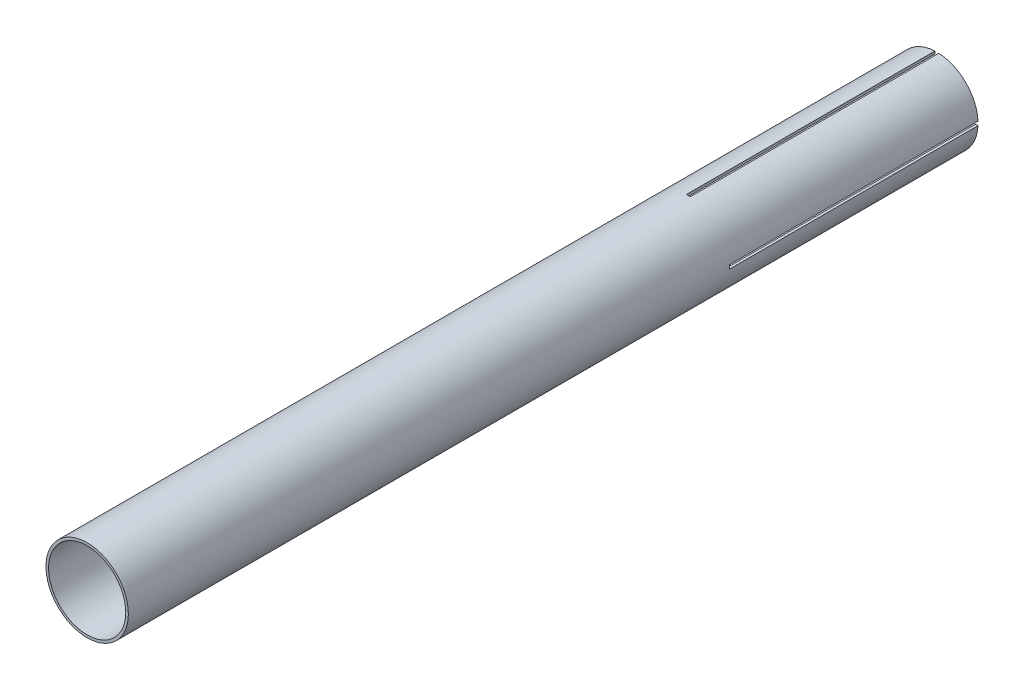
ISO-10303-21;
HEADER;
FILE_DESCRIPTION(('STEP AP214'),'2;1');
FILE_NAME('part.step','',(''),(''),'','','');
FILE_SCHEMA(('AUTOMOTIVE_DESIGN { 1 0 10303 214 1 1 1 1 }'));
ENDSEC;
DATA;
#1=APPLICATION_CONTEXT('core data for automotive mechanical design processes');
#2=APPLICATION_PROTOCOL_DEFINITION('international standard','automotive_design',2000,#1);
#3=PRODUCT_CONTEXT('',#1,'mechanical');
#4=PRODUCT('Part','Part','',(#3));
#5=PRODUCT_RELATED_PRODUCT_CATEGORY('part','',(#4));
#6=PRODUCT_DEFINITION_FORMATION('','',#4);
#7=PRODUCT_DEFINITION_CONTEXT('part definition',#1,'design');
#8=PRODUCT_DEFINITION('design','',#6,#7);
#9=PRODUCT_DEFINITION_SHAPE('','',#8);
#10=(LENGTH_UNIT() NAMED_UNIT(*) SI_UNIT(.MILLI.,.METRE.));
#11=(NAMED_UNIT(*) PLANE_ANGLE_UNIT() SI_UNIT($,.RADIAN.));
#12=(NAMED_UNIT(*) SI_UNIT($,.STERADIAN.) SOLID_ANGLE_UNIT());
#13=UNCERTAINTY_MEASURE_WITH_UNIT(LENGTH_MEASURE(1.E-05),#10,'distance_accuracy_value','');
#14=(GEOMETRIC_REPRESENTATION_CONTEXT(3) GLOBAL_UNCERTAINTY_ASSIGNED_CONTEXT((#13)) GLOBAL_UNIT_ASSIGNED_CONTEXT((#10,
#11,#12)) REPRESENTATION_CONTEXT('',''));
#15=CARTESIAN_POINT('',(0.,0.,0.));
#16=DIRECTION('',(0.,0.,1.));
#17=DIRECTION('',(1.,0.,0.));
#18=AXIS2_PLACEMENT_3D('',#15,#16,#17);
#19=CARTESIAN_POINT('',(0.,0.,0.));
#20=DIRECTION('',(0.,0.,1.));
#21=DIRECTION('',(1.,0.,0.));
#22=AXIS2_PLACEMENT_3D('',#19,#20,#21);
#23=PLANE('',#22);
#24=CARTESIAN_POINT('',(0.,0.,0.));
#25=DIRECTION('',(0.,0.,1.));
#26=DIRECTION('',(1.,0.,0.));
#27=AXIS2_PLACEMENT_3D('',#24,#25,#26);
#28=CIRCLE('',#27,30.);
#29=CARTESIAN_POINT('',(-1.50000000000008,29.9624765331573,0.));
#30=VERTEX_POINT('',#29);
#31=CARTESIAN_POINT('',(-29.9624765331573,1.5000000000001,0.));
#32=VERTEX_POINT('',#31);
#33=EDGE_CURVE('E172',#30,#32,#28,.T.);
#34=ORIENTED_EDGE('',*,*,#33,.T.);
#35=DIRECTION('',(1.,0.,0.));
#36=VECTOR('',#35,1.);
#37=CARTESIAN_POINT('',(-32.0010000000001,1.50000000000011,0.));
#38=LINE('',#37,#36);
#39=CARTESIAN_POINT('',(-31.9648244168492,1.50000000000011,0.));
#40=VERTEX_POINT('',#39);
#41=EDGE_CURVE('E152',#40,#32,#38,.T.);
#42=ORIENTED_EDGE('',*,*,#41,.F.);
#43=CARTESIAN_POINT('',(0.,0.,0.));
#44=DIRECTION('',(0.,0.,1.));
#45=DIRECTION('',(1.,0.,0.));
#46=AXIS2_PLACEMENT_3D('',#43,#44,#45);
#47=CIRCLE('',#46,32.);
#48=CARTESIAN_POINT('',(-1.5,31.9648244168492,0.));
#49=VERTEX_POINT('',#48);
#50=EDGE_CURVE('E335',#49,#40,#47,.T.);
#51=ORIENTED_EDGE('',*,*,#50,.F.);
#52=DIRECTION('',(0.,-1.,0.));
#53=VECTOR('',#52,1.);
#54=CARTESIAN_POINT('',(-1.5,32.001,0.));
#55=LINE('',#54,#53);
#56=EDGE_CURVE('E179',#49,#30,#55,.T.);
#57=ORIENTED_EDGE('',*,*,#56,.T.);
#58=EDGE_LOOP('',(#34,#42,#51,#57));
#59=FACE_BOUND('',#58,.T.);
#60=ADVANCED_FACE('F39',(#59),#23,.F.);
#61=CARTESIAN_POINT('',(29.9624765331573,1.49999999999977,0.));
#62=VERTEX_POINT('',#61);
#63=CARTESIAN_POINT('',(1.5,29.9624765331573,0.));
#64=VERTEX_POINT('',#63);
#65=EDGE_CURVE('E181',#62,#64,#28,.T.);
#66=ORIENTED_EDGE('',*,*,#65,.T.);
#67=DIRECTION('',(0.,-1.,0.));
#68=VECTOR('',#67,1.);
#69=CARTESIAN_POINT('',(1.5,32.001,0.));
#70=LINE('',#69,#68);
#71=CARTESIAN_POINT('',(1.5,31.9648244168492,0.));
#72=VERTEX_POINT('',#71);
#73=EDGE_CURVE('E281',#72,#64,#70,.T.);
#74=ORIENTED_EDGE('',*,*,#73,.F.);
#75=CARTESIAN_POINT('',(31.9648244168492,1.49999999999967,0.));
#76=VERTEX_POINT('',#75);
#77=EDGE_CURVE('E337',#76,#72,#47,.T.);
#78=ORIENTED_EDGE('',*,*,#77,.F.);
#79=DIRECTION('',(-1.,0.,0.));
#80=VECTOR('',#79,1.);
#81=CARTESIAN_POINT('',(32.0010000000004,1.49999999999966,0.));
#82=LINE('',#81,#80);
#83=EDGE_CURVE('E254',#76,#62,#82,.T.);
#84=ORIENTED_EDGE('',*,*,#83,.T.);
#85=EDGE_LOOP('',(#66,#74,#78,#84));
#86=FACE_BOUND('',#85,.T.);
#87=ADVANCED_FACE('F353',(#86),#23,.F.);
#88=CARTESIAN_POINT('',(1.50000000000008,-29.9624765331573,0.));
#89=VERTEX_POINT('',#88);
#90=CARTESIAN_POINT('',(29.9624765331573,-1.50000000000031,0.));
#91=VERTEX_POINT('',#90);
#92=EDGE_CURVE('E187',#89,#91,#28,.T.);
#93=ORIENTED_EDGE('',*,*,#92,.T.);
#94=DIRECTION('',(-1.,0.,0.));
#95=VECTOR('',#94,1.);
#96=CARTESIAN_POINT('',(32.0010000000003,-1.50000000000034,0.));
#97=LINE('',#96,#95);
#98=CARTESIAN_POINT('',(31.9648244168492,-1.50000000000033,0.));
#99=VERTEX_POINT('',#98);
#100=EDGE_CURVE('E245',#99,#91,#97,.T.);
#101=ORIENTED_EDGE('',*,*,#100,.F.);
#102=CARTESIAN_POINT('',(1.5,-31.9648244168492,0.));
#103=VERTEX_POINT('',#102);
#104=EDGE_CURVE('E43',#103,#99,#47,.T.);
#105=ORIENTED_EDGE('',*,*,#104,.F.);
#106=DIRECTION('',(0.,1.,0.));
#107=VECTOR('',#106,1.);
#108=CARTESIAN_POINT('',(1.5,-32.001,0.));
#109=LINE('',#108,#107);
#110=EDGE_CURVE('E213',#103,#89,#109,.T.);
#111=ORIENTED_EDGE('',*,*,#110,.T.);
#112=EDGE_LOOP('',(#93,#101,#105,#111));
#113=FACE_BOUND('',#112,.T.);
#114=ADVANCED_FACE('F374',(#113),#23,.F.);
#115=CARTESIAN_POINT('',(0.,0.,660.));
#116=DIRECTION('',(0.,0.,1.));
#117=DIRECTION('',(1.,0.,0.));
#118=AXIS2_PLACEMENT_3D('',#115,#116,#117);
#119=PLANE('',#118);
#120=CARTESIAN_POINT('',(0.,0.,660.));
#121=DIRECTION('',(0.,0.,1.));
#122=DIRECTION('',(1.,0.,0.));
#123=AXIS2_PLACEMENT_3D('',#120,#121,#122);
#124=CIRCLE('',#123,32.);
#125=CARTESIAN_POINT('',(32.,0.,660.));
#126=VERTEX_POINT('',#125);
#127=EDGE_CURVE('E11',#126,#126,#124,.T.);
#128=ORIENTED_EDGE('',*,*,#127,.T.);
#129=EDGE_LOOP('',(#128));
#130=FACE_BOUND('',#129,.T.);
#131=CARTESIAN_POINT('',(0.,0.,660.));
#132=DIRECTION('',(0.,0.,1.));
#133=DIRECTION('',(1.,0.,0.));
#134=AXIS2_PLACEMENT_3D('',#131,#132,#133);
#135=CIRCLE('',#134,30.);
#136=CARTESIAN_POINT('',(30.,0.,660.));
#137=VERTEX_POINT('',#136);
#138=EDGE_CURVE('E192',#137,#137,#135,.T.);
#139=ORIENTED_EDGE('',*,*,#138,.F.);
#140=EDGE_LOOP('',(#139));
#141=FACE_BOUND('',#140,.T.);
#142=ADVANCED_FACE('F377',(#130,#141),#119,.T.);
#143=CARTESIAN_POINT('',(-31.9648244168492,-1.49999999999989,0.));
#144=VERTEX_POINT('',#143);
#145=CARTESIAN_POINT('',(-1.5,-31.9648244168492,0.));
#146=VERTEX_POINT('',#145);
#147=EDGE_CURVE('E196',#144,#146,#47,.T.);
#148=ORIENTED_EDGE('',*,*,#147,.F.);
#149=DIRECTION('',(1.,0.,0.));
#150=VECTOR('',#149,1.);
#151=CARTESIAN_POINT('',(-32.0010000000001,-1.49999999999989,0.));
#152=LINE('',#151,#150);
#153=CARTESIAN_POINT('',(-29.9624765331573,-1.49999999999998,0.));
#154=VERTEX_POINT('',#153);
#155=EDGE_CURVE('E165',#144,#154,#152,.T.);
#156=ORIENTED_EDGE('',*,*,#155,.T.);
#157=CARTESIAN_POINT('',(-1.5,-29.9624765331573,0.));
#158=VERTEX_POINT('',#157);
#159=EDGE_CURVE('E182',#154,#158,#28,.T.);
#160=ORIENTED_EDGE('',*,*,#159,.T.);
#161=DIRECTION('',(0.,1.,0.));
#162=VECTOR('',#161,1.);
#163=CARTESIAN_POINT('',(-1.5,-32.001,0.));
#164=LINE('',#163,#162);
#165=EDGE_CURVE('E204',#146,#158,#164,.T.);
#166=ORIENTED_EDGE('',*,*,#165,.F.);
#167=EDGE_LOOP('',(#148,#156,#160,#166));
#168=FACE_BOUND('',#167,.T.);
#169=ADVANCED_FACE('F330',(#168),#23,.F.);
#170=CARTESIAN_POINT('',(0.,0.,660.));
#171=DIRECTION('',(0.,0.,-1.));
#172=DIRECTION('',(-1.,0.,0.));
#173=AXIS2_PLACEMENT_3D('',#170,#171,#172);
#174=CYLINDRICAL_SURFACE('',#173,32.);
#175=ORIENTED_EDGE('',*,*,#50,.T.);
#176=DIRECTION('',(0.,0.,-1.));
#177=VECTOR('',#176,1.);
#178=CARTESIAN_POINT('',(-31.9648244168492,1.50000000000003,660.));
#179=LINE('',#178,#177);
#180=CARTESIAN_POINT('',(-31.9648244168492,1.50000000000009,193.));
#181=VERTEX_POINT('',#180);
#182=EDGE_CURVE('E158',#181,#40,#179,.T.);
#183=ORIENTED_EDGE('',*,*,#182,.F.);
#184=CARTESIAN_POINT('',(0.,0.,193.));
#185=DIRECTION('',(0.,0.,1.));
#186=DIRECTION('',(1.,0.,0.));
#187=AXIS2_PLACEMENT_3D('',#184,#185,#186);
#188=CIRCLE('',#187,32.);
#189=CARTESIAN_POINT('',(-31.9648244168492,-1.49999999999991,193.));
#190=VERTEX_POINT('',#189);
#191=EDGE_CURVE('E235',#190,#181,#188,.F.);
#192=ORIENTED_EDGE('',*,*,#191,.F.);
#193=DIRECTION('',(0.,0.,-1.));
#194=VECTOR('',#193,1.);
#195=CARTESIAN_POINT('',(-31.9648244168492,-1.49999999999997,660.));
#196=LINE('',#195,#194);
#197=EDGE_CURVE('E175',#144,#190,#196,.F.);
#198=ORIENTED_EDGE('',*,*,#197,.F.);
#199=ORIENTED_EDGE('',*,*,#147,.T.);
#200=DIRECTION('',(0.,0.,-1.));
#201=VECTOR('',#200,1.);
#202=CARTESIAN_POINT('',(-1.49999999999992,-31.9648244168492,660.));
#203=LINE('',#202,#201);
#204=CARTESIAN_POINT('',(-1.49999999999998,-31.9648244168492,193.));
#205=VERTEX_POINT('',#204);
#206=EDGE_CURVE('E209',#205,#146,#203,.T.);
#207=ORIENTED_EDGE('',*,*,#206,.F.);
#208=CARTESIAN_POINT('',(0.,0.,193.));
#209=DIRECTION('',(0.,0.,1.));
#210=DIRECTION('',(1.,0.,0.));
#211=AXIS2_PLACEMENT_3D('',#208,#209,#210);
#212=CIRCLE('',#211,32.);
#213=CARTESIAN_POINT('',(1.50000000000002,-31.9648244168492,193.));
#214=VERTEX_POINT('',#213);
#215=EDGE_CURVE('E188',#214,#205,#212,.F.);
#216=ORIENTED_EDGE('',*,*,#215,.F.);
#217=DIRECTION('',(0.,0.,-1.));
#218=VECTOR('',#217,1.);
#219=CARTESIAN_POINT('',(1.50000000000008,-31.9648244168492,660.));
#220=LINE('',#219,#218);
#221=EDGE_CURVE('E223',#103,#214,#220,.F.);
#222=ORIENTED_EDGE('',*,*,#221,.F.);
#223=ORIENTED_EDGE('',*,*,#104,.T.);
#224=DIRECTION('',(0.,0.,-1.));
#225=VECTOR('',#224,1.);
#226=CARTESIAN_POINT('',(31.9648244168492,-1.50000000000025,660.));
#227=LINE('',#226,#225);
#228=CARTESIAN_POINT('',(31.9648244168492,-1.50000000000031,193.));
#229=VERTEX_POINT('',#228);
#230=EDGE_CURVE('E250',#229,#99,#227,.T.);
#231=ORIENTED_EDGE('',*,*,#230,.F.);
#232=CARTESIAN_POINT('',(0.,0.,193.));
#233=DIRECTION('',(0.,0.,1.));
#234=DIRECTION('',(1.,0.,0.));
#235=AXIS2_PLACEMENT_3D('',#232,#233,#234);
#236=CIRCLE('',#235,32.);
#237=CARTESIAN_POINT('',(31.9648244168492,1.49999999999969,193.));
#238=VERTEX_POINT('',#237);
#239=EDGE_CURVE('E236',#238,#229,#236,.F.);
#240=ORIENTED_EDGE('',*,*,#239,.F.);
#241=DIRECTION('',(0.,0.,-1.));
#242=VECTOR('',#241,1.);
#243=CARTESIAN_POINT('',(31.9648244168492,1.49999999999975,660.));
#244=LINE('',#243,#242);
#245=EDGE_CURVE('E262',#76,#238,#244,.F.);
#246=ORIENTED_EDGE('',*,*,#245,.F.);
#247=ORIENTED_EDGE('',*,*,#77,.T.);
#248=DIRECTION('',(0.,0.,-1.));
#249=VECTOR('',#248,1.);
#250=CARTESIAN_POINT('',(1.49999999999992,31.9648244168492,660.));
#251=LINE('',#250,#249);
#252=CARTESIAN_POINT('',(1.49999999999998,31.9648244168492,193.));
#253=VERTEX_POINT('',#252);
#254=EDGE_CURVE('E285',#253,#72,#251,.T.);
#255=ORIENTED_EDGE('',*,*,#254,.F.);
#256=CARTESIAN_POINT('',(0.,0.,193.));
#257=DIRECTION('',(0.,0.,1.));
#258=DIRECTION('',(1.,0.,0.));
#259=AXIS2_PLACEMENT_3D('',#256,#257,#258);
#260=CIRCLE('',#259,32.);
#261=CARTESIAN_POINT('',(-1.50000000000002,31.9648244168492,193.));
#262=VERTEX_POINT('',#261);
#263=EDGE_CURVE('E274',#262,#253,#260,.F.);
#264=ORIENTED_EDGE('',*,*,#263,.F.);
#265=DIRECTION('',(0.,0.,-1.));
#266=VECTOR('',#265,1.);
#267=CARTESIAN_POINT('',(-1.50000000000008,31.9648244168492,660.));
#268=LINE('',#267,#266);
#269=EDGE_CURVE('E295',#49,#262,#268,.F.);
#270=ORIENTED_EDGE('',*,*,#269,.F.);
#271=EDGE_LOOP('',(#175,#183,#192,#198,#199,#207,#216,#222,#223,#231,#240,#246,#247,#255,#264,#270));
#272=FACE_BOUND('',#271,.T.);
#273=ORIENTED_EDGE('',*,*,#127,.F.);
#274=EDGE_LOOP('',(#273));
#275=FACE_BOUND('',#274,.T.);
#276=ADVANCED_FACE('F41',(#272,#275),#174,.T.);
#277=CARTESIAN_POINT('',(0.,0.,660.));
#278=DIRECTION('',(0.,0.,-1.));
#279=DIRECTION('',(-1.,0.,0.));
#280=AXIS2_PLACEMENT_3D('',#277,#278,#279);
#281=CYLINDRICAL_SURFACE('',#280,30.);
#282=DIRECTION('',(0.,0.,-1.));
#283=VECTOR('',#282,1.);
#284=CARTESIAN_POINT('',(-29.9624765331573,1.50000000000002,660.));
#285=LINE('',#284,#283);
#286=CARTESIAN_POINT('',(-29.9624765331573,1.50000000000008,193.));
#287=VERTEX_POINT('',#286);
#288=EDGE_CURVE('E155',#287,#32,#285,.T.);
#289=ORIENTED_EDGE('',*,*,#288,.T.);
#290=ORIENTED_EDGE('',*,*,#33,.F.);
#291=DIRECTION('',(0.,0.,-1.));
#292=VECTOR('',#291,1.);
#293=CARTESIAN_POINT('',(-1.50000000000008,29.9624765331573,660.));
#294=LINE('',#293,#292);
#295=CARTESIAN_POINT('',(-1.50000000000002,29.9624765331573,193.));
#296=VERTEX_POINT('',#295);
#297=EDGE_CURVE('E240',#30,#296,#294,.F.);
#298=ORIENTED_EDGE('',*,*,#297,.T.);
#299=CARTESIAN_POINT('',(0.,0.,193.));
#300=DIRECTION('',(0.,0.,1.));
#301=DIRECTION('',(1.,0.,0.));
#302=AXIS2_PLACEMENT_3D('',#299,#300,#301);
#303=CIRCLE('',#302,30.);
#304=CARTESIAN_POINT('',(1.49999999999998,29.9624765331573,193.));
#305=VERTEX_POINT('',#304);
#306=EDGE_CURVE('E277',#296,#305,#303,.F.);
#307=ORIENTED_EDGE('',*,*,#306,.T.);
#308=DIRECTION('',(0.,0.,-1.));
#309=VECTOR('',#308,1.);
#310=CARTESIAN_POINT('',(1.49999999999992,29.9624765331573,660.));
#311=LINE('',#310,#309);
#312=EDGE_CURVE('E299',#305,#64,#311,.T.);
#313=ORIENTED_EDGE('',*,*,#312,.T.);
#314=ORIENTED_EDGE('',*,*,#65,.F.);
#315=DIRECTION('',(0.,0.,-1.));
#316=VECTOR('',#315,1.);
#317=CARTESIAN_POINT('',(29.9624765331573,1.49999999999977,660.));
#318=LINE('',#317,#316);
#319=CARTESIAN_POINT('',(29.9624765331573,1.49999999999971,193.));
#320=VERTEX_POINT('',#319);
#321=EDGE_CURVE('E270',#62,#320,#318,.F.);
#322=ORIENTED_EDGE('',*,*,#321,.T.);
#323=CARTESIAN_POINT('',(0.,0.,193.));
#324=DIRECTION('',(0.,0.,1.));
#325=DIRECTION('',(1.,0.,0.));
#326=AXIS2_PLACEMENT_3D('',#323,#324,#325);
#327=CIRCLE('',#326,30.);
#328=CARTESIAN_POINT('',(29.9624765331573,-1.50000000000029,193.));
#329=VERTEX_POINT('',#328);
#330=EDGE_CURVE('E241',#320,#329,#327,.F.);
#331=ORIENTED_EDGE('',*,*,#330,.T.);
#332=DIRECTION('',(0.,0.,-1.));
#333=VECTOR('',#332,1.);
#334=CARTESIAN_POINT('',(29.9624765331573,-1.50000000000023,660.));
#335=LINE('',#334,#333);
#336=EDGE_CURVE('E266',#329,#91,#335,.T.);
#337=ORIENTED_EDGE('',*,*,#336,.T.);
#338=ORIENTED_EDGE('',*,*,#92,.F.);
#339=DIRECTION('',(0.,0.,-1.));
#340=VECTOR('',#339,1.);
#341=CARTESIAN_POINT('',(1.50000000000008,-29.9624765331573,660.));
#342=LINE('',#341,#340);
#343=CARTESIAN_POINT('',(1.50000000000002,-29.9624765331573,193.));
#344=VERTEX_POINT('',#343);
#345=EDGE_CURVE('E231',#89,#344,#342,.F.);
#346=ORIENTED_EDGE('',*,*,#345,.T.);
#347=CARTESIAN_POINT('',(0.,0.,193.));
#348=DIRECTION('',(0.,0.,1.));
#349=DIRECTION('',(1.,0.,0.));
#350=AXIS2_PLACEMENT_3D('',#347,#348,#349);
#351=CIRCLE('',#350,30.);
#352=CARTESIAN_POINT('',(-1.49999999999998,-29.9624765331573,193.));
#353=VERTEX_POINT('',#352);
#354=EDGE_CURVE('E200',#344,#353,#351,.F.);
#355=ORIENTED_EDGE('',*,*,#354,.T.);
#356=DIRECTION('',(0.,0.,-1.));
#357=VECTOR('',#356,1.);
#358=CARTESIAN_POINT('',(-1.49999999999992,-29.9624765331573,660.));
#359=LINE('',#358,#357);
#360=EDGE_CURVE('E227',#353,#158,#359,.T.);
#361=ORIENTED_EDGE('',*,*,#360,.T.);
#362=ORIENTED_EDGE('',*,*,#159,.F.);
#363=DIRECTION('',(0.,0.,-1.));
#364=VECTOR('',#363,1.);
#365=CARTESIAN_POINT('',(-29.9624765331573,-1.49999999999998,660.));
#366=LINE('',#365,#364);
#367=CARTESIAN_POINT('',(-29.9624765331573,-1.49999999999992,193.));
#368=VERTEX_POINT('',#367);
#369=EDGE_CURVE('E176',#154,#368,#366,.F.);
#370=ORIENTED_EDGE('',*,*,#369,.T.);
#371=CARTESIAN_POINT('',(0.,0.,193.));
#372=DIRECTION('',(0.,0.,1.));
#373=DIRECTION('',(1.,0.,0.));
#374=AXIS2_PLACEMENT_3D('',#371,#372,#373);
#375=CIRCLE('',#374,30.);
#376=EDGE_CURVE('E164',#368,#287,#375,.F.);
#377=ORIENTED_EDGE('',*,*,#376,.T.);
#378=EDGE_LOOP('',(#289,#290,#298,#307,#313,#314,#322,#331,#337,#338,#346,#355,#361,#362,#370,#377));
#379=FACE_BOUND('',#378,.T.);
#380=ORIENTED_EDGE('',*,*,#138,.T.);
#381=EDGE_LOOP('',(#380));
#382=FACE_BOUND('',#381,.T.);
#383=ADVANCED_FACE('F169',(#379,#382),#281,.F.);
#384=CARTESIAN_POINT('',(-1.5,-32.001,0.));
#385=DIRECTION('',(-1.,0.,0.));
#386=DIRECTION('',(0.,0.,1.));
#387=AXIS2_PLACEMENT_3D('',#384,#385,#386);
#388=PLANE('',#387);
#389=ORIENTED_EDGE('',*,*,#206,.T.);
#390=ORIENTED_EDGE('',*,*,#165,.T.);
#391=ORIENTED_EDGE('',*,*,#360,.F.);
#392=DIRECTION('',(0.,1.,0.));
#393=VECTOR('',#392,1.);
#394=CARTESIAN_POINT('',(-1.49999999999998,-32.001,193.));
#395=LINE('',#394,#393);
#396=EDGE_CURVE('E205',#205,#353,#395,.T.);
#397=ORIENTED_EDGE('',*,*,#396,.F.);
#398=EDGE_LOOP('',(#389,#390,#391,#397));
#399=FACE_BOUND('',#398,.T.);
#400=ADVANCED_FACE('F411',(#399),#388,.F.);
#401=CARTESIAN_POINT('',(1.5,-32.001,0.));
#402=DIRECTION('',(1.,0.,0.));
#403=DIRECTION('',(0.,0.,-1.));
#404=AXIS2_PLACEMENT_3D('',#401,#402,#403);
#405=PLANE('',#404);
#406=ORIENTED_EDGE('',*,*,#221,.T.);
#407=DIRECTION('',(0.,1.,0.));
#408=VECTOR('',#407,1.);
#409=CARTESIAN_POINT('',(1.50000000000002,-32.001,193.));
#410=LINE('',#409,#408);
#411=EDGE_CURVE('E208',#214,#344,#410,.T.);
#412=ORIENTED_EDGE('',*,*,#411,.T.);
#413=ORIENTED_EDGE('',*,*,#345,.F.);
#414=ORIENTED_EDGE('',*,*,#110,.F.);
#415=EDGE_LOOP('',(#406,#412,#413,#414));
#416=FACE_BOUND('',#415,.T.);
#417=ADVANCED_FACE('F408',(#416),#405,.F.);
#418=CARTESIAN_POINT('',(-1.49999999999998,-32.001,193.));
#419=DIRECTION('',(0.,0.,1.));
#420=DIRECTION('',(1.,0.,0.));
#421=AXIS2_PLACEMENT_3D('',#418,#419,#420);
#422=PLANE('',#421);
#423=ORIENTED_EDGE('',*,*,#215,.T.);
#424=ORIENTED_EDGE('',*,*,#396,.T.);
#425=ORIENTED_EDGE('',*,*,#354,.F.);
#426=ORIENTED_EDGE('',*,*,#411,.F.);
#427=EDGE_LOOP('',(#423,#424,#425,#426));
#428=FACE_BOUND('',#427,.T.);
#429=ADVANCED_FACE('F403',(#428),#422,.F.);
#430=CARTESIAN_POINT('',(32.0010000000003,-1.50000000000034,0.));
#431=DIRECTION('',(0.,-1.,0.));
#432=DIRECTION('',(1.,0.,0.));
#433=AXIS2_PLACEMENT_3D('',#430,#431,#432);
#434=PLANE('',#433);
#435=ORIENTED_EDGE('',*,*,#230,.T.);
#436=ORIENTED_EDGE('',*,*,#100,.T.);
#437=ORIENTED_EDGE('',*,*,#336,.F.);
#438=DIRECTION('',(-1.,0.,0.));
#439=VECTOR('',#438,1.);
#440=CARTESIAN_POINT('',(32.0010000000003,-1.50000000000031,193.));
#441=LINE('',#440,#439);
#442=EDGE_CURVE('E246',#229,#329,#441,.T.);
#443=ORIENTED_EDGE('',*,*,#442,.F.);
#444=EDGE_LOOP('',(#435,#436,#437,#443));
#445=FACE_BOUND('',#444,.T.);
#446=ADVANCED_FACE('F391',(#445),#434,.F.);
#447=CARTESIAN_POINT('',(32.0010000000004,1.49999999999966,0.));
#448=DIRECTION('',(0.,1.,0.));
#449=DIRECTION('',(-1.,0.,0.));
#450=AXIS2_PLACEMENT_3D('',#447,#448,#449);
#451=PLANE('',#450);
#452=ORIENTED_EDGE('',*,*,#245,.T.);
#453=DIRECTION('',(-1.,0.,0.));
#454=VECTOR('',#453,1.);
#455=CARTESIAN_POINT('',(32.0010000000004,1.49999999999969,193.));
#456=LINE('',#455,#454);
#457=EDGE_CURVE('E249',#238,#320,#456,.T.);
#458=ORIENTED_EDGE('',*,*,#457,.T.);
#459=ORIENTED_EDGE('',*,*,#321,.F.);
#460=ORIENTED_EDGE('',*,*,#83,.F.);
#461=EDGE_LOOP('',(#452,#458,#459,#460));
#462=FACE_BOUND('',#461,.T.);
#463=ADVANCED_FACE('F395',(#462),#451,.F.);
#464=CARTESIAN_POINT('',(32.0010000000003,-1.50000000000031,193.));
#465=DIRECTION('',(0.,0.,1.));
#466=DIRECTION('',(1.,0.,0.));
#467=AXIS2_PLACEMENT_3D('',#464,#465,#466);
#468=PLANE('',#467);
#469=ORIENTED_EDGE('',*,*,#239,.T.);
#470=ORIENTED_EDGE('',*,*,#442,.T.);
#471=ORIENTED_EDGE('',*,*,#330,.F.);
#472=ORIENTED_EDGE('',*,*,#457,.F.);
#473=EDGE_LOOP('',(#469,#470,#471,#472));
#474=FACE_BOUND('',#473,.T.);
#475=ADVANCED_FACE('F393',(#474),#468,.F.);
#476=CARTESIAN_POINT('',(1.5,32.001,0.));
#477=DIRECTION('',(1.,0.,0.));
#478=DIRECTION('',(0.,0.,-1.));
#479=AXIS2_PLACEMENT_3D('',#476,#477,#478);
#480=PLANE('',#479);
#481=ORIENTED_EDGE('',*,*,#254,.T.);
#482=ORIENTED_EDGE('',*,*,#73,.T.);
#483=ORIENTED_EDGE('',*,*,#312,.F.);
#484=DIRECTION('',(0.,-1.,0.));
#485=VECTOR('',#484,1.);
#486=CARTESIAN_POINT('',(1.49999999999998,32.001,193.));
#487=LINE('',#486,#485);
#488=EDGE_CURVE('E63',#253,#305,#487,.T.);
#489=ORIENTED_EDGE('',*,*,#488,.F.);
#490=EDGE_LOOP('',(#481,#482,#483,#489));
#491=FACE_BOUND('',#490,.T.);
#492=ADVANCED_FACE('F356',(#491),#480,.F.);
#493=CARTESIAN_POINT('',(-1.5,32.001,0.));
#494=DIRECTION('',(-1.,0.,0.));
#495=DIRECTION('',(0.,0.,1.));
#496=AXIS2_PLACEMENT_3D('',#493,#494,#495);
#497=PLANE('',#496);
#498=ORIENTED_EDGE('',*,*,#269,.T.);
#499=DIRECTION('',(0.,-1.,0.));
#500=VECTOR('',#499,1.);
#501=CARTESIAN_POINT('',(-1.50000000000002,32.001,193.));
#502=LINE('',#501,#500);
#503=EDGE_CURVE('E284',#262,#296,#502,.T.);
#504=ORIENTED_EDGE('',*,*,#503,.T.);
#505=ORIENTED_EDGE('',*,*,#297,.F.);
#506=ORIENTED_EDGE('',*,*,#56,.F.);
#507=EDGE_LOOP('',(#498,#504,#505,#506));
#508=FACE_BOUND('',#507,.T.);
#509=ADVANCED_FACE('F359',(#508),#497,.F.);
#510=CARTESIAN_POINT('',(1.49999999999998,32.001,193.));
#511=DIRECTION('',(0.,0.,1.));
#512=DIRECTION('',(1.,0.,0.));
#513=AXIS2_PLACEMENT_3D('',#510,#511,#512);
#514=PLANE('',#513);
#515=ORIENTED_EDGE('',*,*,#263,.T.);
#516=ORIENTED_EDGE('',*,*,#488,.T.);
#517=ORIENTED_EDGE('',*,*,#306,.F.);
#518=ORIENTED_EDGE('',*,*,#503,.F.);
#519=EDGE_LOOP('',(#515,#516,#517,#518));
#520=FACE_BOUND('',#519,.T.);
#521=ADVANCED_FACE('F357',(#520),#514,.F.);
#522=CARTESIAN_POINT('',(-32.0010000000001,1.50000000000011,0.));
#523=DIRECTION('',(0.,1.,0.));
#524=DIRECTION('',(-1.,0.,0.));
#525=AXIS2_PLACEMENT_3D('',#522,#523,#524);
#526=PLANE('',#525);
#527=ORIENTED_EDGE('',*,*,#182,.T.);
#528=ORIENTED_EDGE('',*,*,#41,.T.);
#529=ORIENTED_EDGE('',*,*,#288,.F.);
#530=DIRECTION('',(1.,0.,0.));
#531=VECTOR('',#530,1.);
#532=CARTESIAN_POINT('',(-32.0010000000001,1.50000000000009,193.));
#533=LINE('',#532,#531);
#534=EDGE_CURVE('E55',#181,#287,#533,.T.);
#535=ORIENTED_EDGE('',*,*,#534,.F.);
#536=EDGE_LOOP('',(#527,#528,#529,#535));
#537=FACE_BOUND('',#536,.T.);
#538=ADVANCED_FACE('F154',(#537),#526,.F.);
#539=CARTESIAN_POINT('',(-32.0010000000001,-1.49999999999989,0.));
#540=DIRECTION('',(0.,-1.,0.));
#541=DIRECTION('',(1.,0.,0.));
#542=AXIS2_PLACEMENT_3D('',#539,#540,#541);
#543=PLANE('',#542);
#544=ORIENTED_EDGE('',*,*,#197,.T.);
#545=DIRECTION('',(1.,0.,0.));
#546=VECTOR('',#545,1.);
#547=CARTESIAN_POINT('',(-32.0010000000001,-1.49999999999991,193.));
#548=LINE('',#547,#546);
#549=EDGE_CURVE('E311',#190,#368,#548,.T.);
#550=ORIENTED_EDGE('',*,*,#549,.T.);
#551=ORIENTED_EDGE('',*,*,#369,.F.);
#552=ORIENTED_EDGE('',*,*,#155,.F.);
#553=EDGE_LOOP('',(#544,#550,#551,#552));
#554=FACE_BOUND('',#553,.T.);
#555=ADVANCED_FACE('F326',(#554),#543,.F.);
#556=CARTESIAN_POINT('',(-32.0010000000001,1.50000000000009,193.));
#557=DIRECTION('',(0.,0.,1.));
#558=DIRECTION('',(1.,0.,0.));
#559=AXIS2_PLACEMENT_3D('',#556,#557,#558);
#560=PLANE('',#559);
#561=ORIENTED_EDGE('',*,*,#191,.T.);
#562=ORIENTED_EDGE('',*,*,#534,.T.);
#563=ORIENTED_EDGE('',*,*,#376,.F.);
#564=ORIENTED_EDGE('',*,*,#549,.F.);
#565=EDGE_LOOP('',(#561,#562,#563,#564));
#566=FACE_BOUND('',#565,.T.);
#567=ADVANCED_FACE('F362',(#566),#560,.F.);
#568=CLOSED_SHELL('',(#60,#87,#114,#142,#169,#276,#383,#400,#417,#429,#446,#463,#475,#492,#509,
#521,#538,#555,#567));
#569=MANIFOLD_SOLID_BREP('B2',#568);
#570=ADVANCED_BREP_SHAPE_REPRESENTATION('',(#18,#569),#14);
#571=SHAPE_DEFINITION_REPRESENTATION(#9,#570);
ENDSEC;
END-ISO-10303-21;
